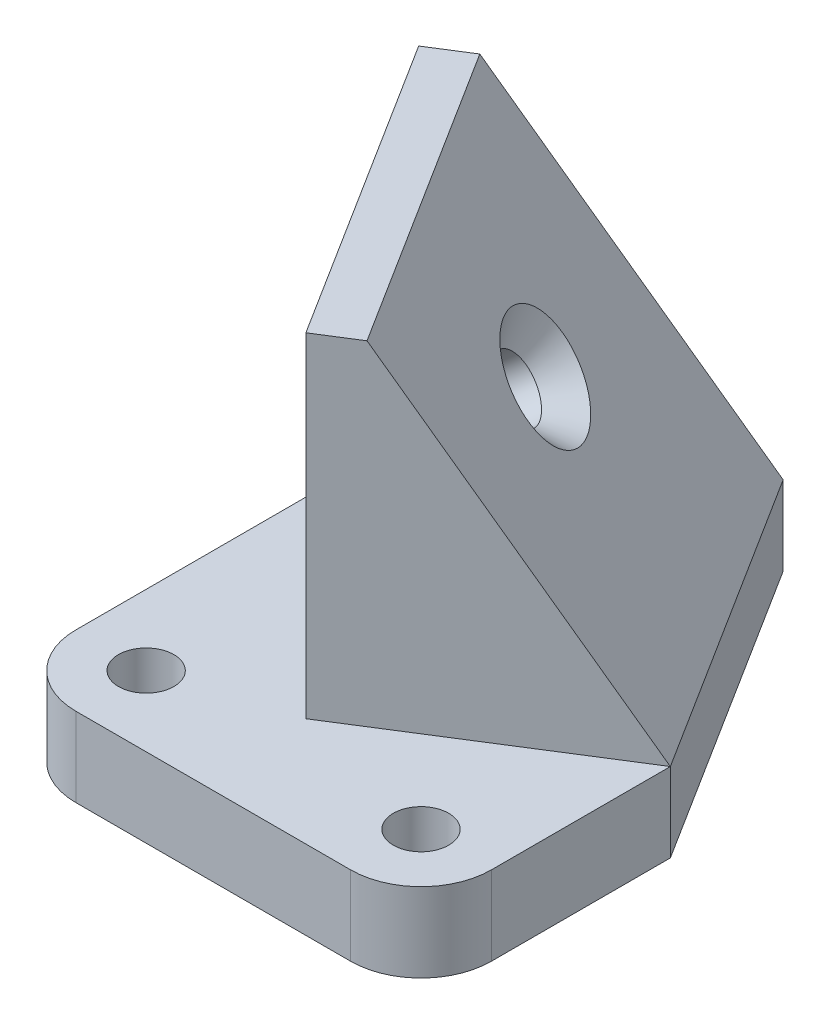
ISO-10303-21;
HEADER;
FILE_DESCRIPTION(('STEP AP214'),'2;1');
FILE_NAME('part.step','',(''),(''),'','','');
FILE_SCHEMA(('AUTOMOTIVE_DESIGN { 1 0 10303 214 1 1 1 1 }'));
ENDSEC;
DATA;
#1=APPLICATION_CONTEXT('core data for automotive mechanical design processes');
#2=APPLICATION_PROTOCOL_DEFINITION('international standard','automotive_design',2000,#1);
#3=PRODUCT_CONTEXT('',#1,'mechanical');
#4=PRODUCT('Part','Part','',(#3));
#5=PRODUCT_RELATED_PRODUCT_CATEGORY('part','',(#4));
#6=PRODUCT_DEFINITION_FORMATION('','',#4);
#7=PRODUCT_DEFINITION_CONTEXT('part definition',#1,'design');
#8=PRODUCT_DEFINITION('design','',#6,#7);
#9=PRODUCT_DEFINITION_SHAPE('','',#8);
#10=(LENGTH_UNIT() NAMED_UNIT(*) SI_UNIT(.MILLI.,.METRE.));
#11=(NAMED_UNIT(*) PLANE_ANGLE_UNIT() SI_UNIT($,.RADIAN.));
#12=(NAMED_UNIT(*) SI_UNIT($,.STERADIAN.) SOLID_ANGLE_UNIT());
#13=UNCERTAINTY_MEASURE_WITH_UNIT(LENGTH_MEASURE(1.E-05),#10,'distance_accuracy_value','');
#14=(GEOMETRIC_REPRESENTATION_CONTEXT(3) GLOBAL_UNCERTAINTY_ASSIGNED_CONTEXT((#13)) GLOBAL_UNIT_ASSIGNED_CONTEXT((#10,
#11,#12)) REPRESENTATION_CONTEXT('',''));
#15=CARTESIAN_POINT('',(0.,0.,0.));
#16=DIRECTION('',(0.,0.,1.));
#17=DIRECTION('',(1.,0.,0.));
#18=AXIS2_PLACEMENT_3D('',#15,#16,#17);
#19=CARTESIAN_POINT('',(0.,14.2875,-45.));
#20=DIRECTION('',(-0.846153846153846,0.,0.532938710021193));
#21=DIRECTION('',(0.532938710021193,0.,0.846153846153846));
#22=AXIS2_PLACEMENT_3D('',#19,#20,#21);
#23=PLANE('',#22);
#24=DIRECTION('',(-0.532938710021193,0.,-0.846153846153846));
#25=VECTOR('',#24,1.);
#26=CARTESIAN_POINT('',(0.,14.2875,-45.));
#27=LINE('',#26,#25);
#28=CARTESIAN_POINT('',(0.,14.2875,-45.));
#29=VERTEX_POINT('',#28);
#30=CARTESIAN_POINT('',(-34.6410161513775,14.2875,-100.));
#31=VERTEX_POINT('',#30);
#32=EDGE_CURVE('E285',#29,#31,#27,.T.);
#33=ORIENTED_EDGE('',*,*,#32,.F.);
#34=DIRECTION('',(0.,-1.,0.));
#35=VECTOR('',#34,1.);
#36=CARTESIAN_POINT('',(0.,14.2875,-45.));
#37=LINE('',#36,#35);
#38=CARTESIAN_POINT('',(0.,0.,-45.));
#39=VERTEX_POINT('',#38);
#40=EDGE_CURVE('E137',#29,#39,#37,.T.);
#41=ORIENTED_EDGE('',*,*,#40,.T.);
#42=DIRECTION('',(-0.532938710021193,0.,-0.846153846153846));
#43=VECTOR('',#42,1.);
#44=CARTESIAN_POINT('',(0.,0.,-45.));
#45=LINE('',#44,#43);
#46=CARTESIAN_POINT('',(-34.6410161513775,0.,-100.));
#47=VERTEX_POINT('',#46);
#48=EDGE_CURVE('E231',#39,#47,#45,.T.);
#49=ORIENTED_EDGE('',*,*,#48,.T.);
#50=DIRECTION('',(0.,-1.,0.));
#51=VECTOR('',#50,1.);
#52=CARTESIAN_POINT('',(-34.6410161513775,14.2875,-100.));
#53=LINE('',#52,#51);
#54=EDGE_CURVE('E140',#31,#47,#53,.T.);
#55=ORIENTED_EDGE('',*,*,#54,.F.);
#56=EDGE_LOOP('',(#33,#41,#49,#55));
#57=FACE_BOUND('',#56,.T.);
#58=ADVANCED_FACE('F34',(#57),#23,.F.);
#59=CARTESIAN_POINT('',(-34.6410161513775,14.2875,-100.));
#60=DIRECTION('',(0.532938710021193,0.,0.846153846153846));
#61=DIRECTION('',(0.846153846153846,0.,-0.532938710021193));
#62=AXIS2_PLACEMENT_3D('',#59,#60,#61);
#63=PLANE('',#62);
#64=DIRECTION('',(-0.46513764580854,0.835356795183334,0.292960740019407));
#65=VECTOR('',#64,1.);
#66=CARTESIAN_POINT('',(-34.6410161513776,14.2875,-100.));
#67=LINE('',#66,#65);
#68=CARTESIAN_POINT('',(-68.2307692307692,74.6125,-78.8439422010183));
#69=VERTEX_POINT('',#68);
#70=EDGE_CURVE('E288',#31,#69,#67,.T.);
#71=ORIENTED_EDGE('',*,*,#70,.F.);
#72=ORIENTED_EDGE('',*,*,#54,.T.);
#73=DIRECTION('',(-0.846153846153846,0.,0.532938710021193));
#74=VECTOR('',#73,1.);
#75=CARTESIAN_POINT('',(-34.6410161513775,0.,-100.));
#76=LINE('',#75,#74);
#77=CARTESIAN_POINT('',(-75.,0.,-74.5804325208488));
#78=VERTEX_POINT('',#77);
#79=EDGE_CURVE('E236',#47,#78,#76,.T.);
#80=ORIENTED_EDGE('',*,*,#79,.T.);
#81=DIRECTION('',(0.,-1.,0.));
#82=VECTOR('',#81,1.);
#83=CARTESIAN_POINT('',(-75.,14.2875,-74.5804325208488));
#84=LINE('',#83,#82);
#85=CARTESIAN_POINT('',(-75.,14.2875,-74.5804325208488));
#86=VERTEX_POINT('',#85);
#87=EDGE_CURVE('E148',#86,#78,#84,.T.);
#88=ORIENTED_EDGE('',*,*,#87,.F.);
#89=DIRECTION('',(0.,-1.,0.));
#90=VECTOR('',#89,1.);
#91=CARTESIAN_POINT('',(-75.,74.6125,-74.5804325208488));
#92=LINE('',#91,#90);
#93=CARTESIAN_POINT('',(-75.,74.6125,-74.5804325208488));
#94=VERTEX_POINT('',#93);
#95=EDGE_CURVE('E249',#94,#86,#92,.T.);
#96=ORIENTED_EDGE('',*,*,#95,.F.);
#97=DIRECTION('',(-0.846153846153846,0.,0.532938710021193));
#98=VECTOR('',#97,1.);
#99=CARTESIAN_POINT('',(-34.6410161513775,74.6125,-100.));
#100=LINE('',#99,#98);
#101=EDGE_CURVE('E299',#69,#94,#100,.T.);
#102=ORIENTED_EDGE('',*,*,#101,.F.);
#103=EDGE_LOOP('',(#71,#72,#80,#88,#96,#102));
#104=FACE_BOUND('',#103,.T.);
#105=ADVANCED_FACE('F181',(#104),#63,.F.);
#106=CARTESIAN_POINT('',(0.,74.6125,-45.));
#107=DIRECTION('',(0.532938710021193,0.,0.846153846153846));
#108=DIRECTION('',(0.846153846153846,0.,-0.532938710021193));
#109=AXIS2_PLACEMENT_3D('',#106,#107,#108);
#110=PLANE('',#109);
#111=DIRECTION('',(-0.846153846153846,0.,0.532938710021193));
#112=VECTOR('',#111,1.);
#113=CARTESIAN_POINT('',(0.,14.2875,-45.));
#114=LINE('',#113,#112);
#115=CARTESIAN_POINT('',(-40.3589838486224,14.2875,-19.5804325208488));
#116=VERTEX_POINT('',#115);
#117=EDGE_CURVE('E292',#29,#116,#114,.T.);
#118=ORIENTED_EDGE('',*,*,#117,.F.);
#119=DIRECTION('',(0.46513764580854,-0.835356795183334,-0.292960740019406));
#120=VECTOR('',#119,1.);
#121=CARTESIAN_POINT('',(-33.5897530793917,74.6125,-23.8439422010184));
#122=LINE('',#121,#120);
#123=CARTESIAN_POINT('',(-33.5897530793917,74.6125,-23.8439422010184));
#124=VERTEX_POINT('',#123);
#125=EDGE_CURVE('E282',#124,#29,#122,.T.);
#126=ORIENTED_EDGE('',*,*,#125,.F.);
#127=DIRECTION('',(-0.846153846153846,0.,0.532938710021193));
#128=VECTOR('',#127,1.);
#129=CARTESIAN_POINT('',(0.,74.6125,-45.));
#130=LINE('',#129,#128);
#131=CARTESIAN_POINT('',(-40.3589838486224,74.6125,-19.5804325208488));
#132=VERTEX_POINT('',#131);
#133=EDGE_CURVE('E293',#124,#132,#130,.T.);
#134=ORIENTED_EDGE('',*,*,#133,.T.);
#135=DIRECTION('',(0.,-1.,0.));
#136=VECTOR('',#135,1.);
#137=CARTESIAN_POINT('',(-40.3589838486224,74.6125,-19.5804325208488));
#138=LINE('',#137,#136);
#139=EDGE_CURVE('E301',#132,#116,#138,.T.);
#140=ORIENTED_EDGE('',*,*,#139,.T.);
#141=EDGE_LOOP('',(#118,#126,#134,#140));
#142=FACE_BOUND('',#141,.T.);
#143=ADVANCED_FACE('F172',(#142),#110,.T.);
#144=CARTESIAN_POINT('',(0.,74.6125,-45.));
#145=DIRECTION('',(0.,-1.,0.));
#146=DIRECTION('',(0.,0.,-1.));
#147=AXIS2_PLACEMENT_3D('',#144,#145,#146);
#148=PLANE('',#147);
#149=DIRECTION('',(-0.532938710021193,0.,-0.846153846153846));
#150=VECTOR('',#149,1.);
#151=CARTESIAN_POINT('',(-33.5897530793917,74.6125,-23.8439422010184));
#152=LINE('',#151,#150);
#153=EDGE_CURVE('E281',#124,#69,#152,.T.);
#154=ORIENTED_EDGE('',*,*,#153,.T.);
#155=ORIENTED_EDGE('',*,*,#101,.T.);
#156=DIRECTION('',(0.532938710021193,0.,0.846153846153846));
#157=VECTOR('',#156,1.);
#158=CARTESIAN_POINT('',(-75.,74.6125,-74.5804325208488));
#159=LINE('',#158,#157);
#160=EDGE_CURVE('E295',#94,#132,#159,.T.);
#161=ORIENTED_EDGE('',*,*,#160,.T.);
#162=ORIENTED_EDGE('',*,*,#133,.F.);
#163=EDGE_LOOP('',(#154,#155,#161,#162));
#164=FACE_BOUND('',#163,.T.);
#165=ADVANCED_FACE('F169',(#164),#148,.F.);
#166=CARTESIAN_POINT('',(0.,14.2875,0.));
#167=DIRECTION('',(0.,0.,1.));
#168=DIRECTION('',(1.,0.,0.));
#169=AXIS2_PLACEMENT_3D('',#166,#167,#168);
#170=PLANE('',#169);
#171=DIRECTION('',(-1.,0.,0.));
#172=VECTOR('',#171,1.);
#173=CARTESIAN_POINT('',(0.,0.,0.));
#174=LINE('',#173,#172);
#175=CARTESIAN_POINT('',(-12.7,0.,0.));
#176=VERTEX_POINT('',#175);
#177=CARTESIAN_POINT('',(-62.3,0.,0.));
#178=VERTEX_POINT('',#177);
#179=EDGE_CURVE('E246',#176,#178,#174,.T.);
#180=ORIENTED_EDGE('',*,*,#179,.F.);
#181=DIRECTION('',(0.,-1.,0.));
#182=VECTOR('',#181,1.);
#183=CARTESIAN_POINT('',(-12.7,14.2875,0.));
#184=LINE('',#183,#182);
#185=CARTESIAN_POINT('',(-12.7,14.2875,0.));
#186=VERTEX_POINT('',#185);
#187=EDGE_CURVE('E207',#176,#186,#184,.F.);
#188=ORIENTED_EDGE('',*,*,#187,.T.);
#189=DIRECTION('',(-1.,0.,0.));
#190=VECTOR('',#189,1.);
#191=CARTESIAN_POINT('',(0.,14.2875,0.));
#192=LINE('',#191,#190);
#193=CARTESIAN_POINT('',(-62.3,14.2875,0.));
#194=VERTEX_POINT('',#193);
#195=EDGE_CURVE('E232',#186,#194,#192,.T.);
#196=ORIENTED_EDGE('',*,*,#195,.T.);
#197=DIRECTION('',(0.,-1.,0.));
#198=VECTOR('',#197,1.);
#199=CARTESIAN_POINT('',(-62.3,14.2875,0.));
#200=LINE('',#199,#198);
#201=EDGE_CURVE('E213',#194,#178,#200,.T.);
#202=ORIENTED_EDGE('',*,*,#201,.T.);
#203=EDGE_LOOP('',(#180,#188,#196,#202));
#204=FACE_BOUND('',#203,.T.);
#205=ADVANCED_FACE('F171',(#204),#170,.T.);
#206=CARTESIAN_POINT('',(0.,14.2875,0.));
#207=DIRECTION('',(-1.,0.,0.));
#208=DIRECTION('',(0.,0.,1.));
#209=AXIS2_PLACEMENT_3D('',#206,#207,#208);
#210=PLANE('',#209);
#211=DIRECTION('',(0.,0.,-1.));
#212=VECTOR('',#211,1.);
#213=CARTESIAN_POINT('',(0.,14.2875,0.));
#214=LINE('',#213,#212);
#215=CARTESIAN_POINT('',(0.,14.2875,-12.7));
#216=VERTEX_POINT('',#215);
#217=EDGE_CURVE('E223',#216,#29,#214,.T.);
#218=ORIENTED_EDGE('',*,*,#217,.F.);
#219=DIRECTION('',(0.,-1.,0.));
#220=VECTOR('',#219,1.);
#221=CARTESIAN_POINT('',(0.,0.,-12.7));
#222=LINE('',#221,#220);
#223=CARTESIAN_POINT('',(0.,0.,-12.7));
#224=VERTEX_POINT('',#223);
#225=EDGE_CURVE('E133',#216,#224,#222,.T.);
#226=ORIENTED_EDGE('',*,*,#225,.T.);
#227=DIRECTION('',(0.,0.,-1.));
#228=VECTOR('',#227,1.);
#229=CARTESIAN_POINT('',(0.,0.,0.));
#230=LINE('',#229,#228);
#231=EDGE_CURVE('E222',#224,#39,#230,.T.);
#232=ORIENTED_EDGE('',*,*,#231,.T.);
#233=ORIENTED_EDGE('',*,*,#40,.F.);
#234=EDGE_LOOP('',(#218,#226,#232,#233));
#235=FACE_BOUND('',#234,.T.);
#236=ADVANCED_FACE('F178',(#235),#210,.F.);
#237=CARTESIAN_POINT('',(-75.,14.2875,0.));
#238=DIRECTION('',(-1.,0.,0.));
#239=DIRECTION('',(0.,0.,1.));
#240=AXIS2_PLACEMENT_3D('',#237,#238,#239);
#241=PLANE('',#240);
#242=DIRECTION('',(0.,0.,-1.));
#243=VECTOR('',#242,1.);
#244=CARTESIAN_POINT('',(-75.,0.,0.));
#245=LINE('',#244,#243);
#246=CARTESIAN_POINT('',(-75.,0.,-12.7));
#247=VERTEX_POINT('',#246);
#248=EDGE_CURVE('E248',#247,#78,#245,.T.);
#249=ORIENTED_EDGE('',*,*,#248,.F.);
#250=DIRECTION('',(0.,-1.,0.));
#251=VECTOR('',#250,1.);
#252=CARTESIAN_POINT('',(-75.,14.2875,-12.7));
#253=LINE('',#252,#251);
#254=CARTESIAN_POINT('',(-75.,14.2875,-12.7));
#255=VERTEX_POINT('',#254);
#256=EDGE_CURVE('E11',#247,#255,#253,.F.);
#257=ORIENTED_EDGE('',*,*,#256,.T.);
#258=DIRECTION('',(0.,0.,-1.));
#259=VECTOR('',#258,1.);
#260=CARTESIAN_POINT('',(-75.,14.2875,0.));
#261=LINE('',#260,#259);
#262=EDGE_CURVE('E234',#255,#86,#261,.T.);
#263=ORIENTED_EDGE('',*,*,#262,.T.);
#264=ORIENTED_EDGE('',*,*,#87,.T.);
#265=EDGE_LOOP('',(#249,#257,#263,#264));
#266=FACE_BOUND('',#265,.T.);
#267=ADVANCED_FACE('F195',(#266),#241,.T.);
#268=CARTESIAN_POINT('',(0.,14.2875,0.));
#269=DIRECTION('',(0.,-1.,0.));
#270=DIRECTION('',(0.,0.,-1.));
#271=AXIS2_PLACEMENT_3D('',#268,#269,#270);
#272=PLANE('',#271);
#273=CARTESIAN_POINT('',(-12.7,14.2875,-12.7));
#274=DIRECTION('',(0.,1.,0.));
#275=DIRECTION('',(0.,0.,1.));
#276=AXIS2_PLACEMENT_3D('',#273,#274,#275);
#277=CIRCLE('',#276,4.99999999999999);
#278=CARTESIAN_POINT('',(-12.7,14.2875,-7.70000000000001));
#279=VERTEX_POINT('',#278);
#280=EDGE_CURVE('E263',#279,#279,#277,.T.);
#281=ORIENTED_EDGE('',*,*,#280,.F.);
#282=EDGE_LOOP('',(#281));
#283=FACE_BOUND('',#282,.T.);
#284=CARTESIAN_POINT('',(-62.3,14.2875,-12.7));
#285=DIRECTION('',(0.,1.,0.));
#286=DIRECTION('',(0.,0.,1.));
#287=AXIS2_PLACEMENT_3D('',#284,#285,#286);
#288=CIRCLE('',#287,4.99999999999999);
#289=CARTESIAN_POINT('',(-62.3,14.2875,-7.7));
#290=VERTEX_POINT('',#289);
#291=EDGE_CURVE('E266',#290,#290,#288,.T.);
#292=ORIENTED_EDGE('',*,*,#291,.F.);
#293=EDGE_LOOP('',(#292));
#294=FACE_BOUND('',#293,.T.);
#295=ORIENTED_EDGE('',*,*,#195,.F.);
#296=CARTESIAN_POINT('',(-12.7,14.2875,-12.7));
#297=DIRECTION('',(0.,-1.,0.));
#298=DIRECTION('',(0.,0.,-1.));
#299=AXIS2_PLACEMENT_3D('',#296,#297,#298);
#300=CIRCLE('',#299,12.7);
#301=EDGE_CURVE('E42',#186,#216,#300,.F.);
#302=ORIENTED_EDGE('',*,*,#301,.T.);
#303=ORIENTED_EDGE('',*,*,#217,.T.);
#304=ORIENTED_EDGE('',*,*,#117,.T.);
#305=DIRECTION('',(0.532938710021193,0.,0.846153846153846));
#306=VECTOR('',#305,1.);
#307=CARTESIAN_POINT('',(-75.,14.2875,-74.5804325208488));
#308=LINE('',#307,#306);
#309=EDGE_CURVE('E296',#86,#116,#308,.T.);
#310=ORIENTED_EDGE('',*,*,#309,.F.);
#311=ORIENTED_EDGE('',*,*,#262,.F.);
#312=CARTESIAN_POINT('',(-62.3,14.2875,-12.7));
#313=DIRECTION('',(0.,-1.,0.));
#314=DIRECTION('',(0.,0.,-1.));
#315=AXIS2_PLACEMENT_3D('',#312,#313,#314);
#316=CIRCLE('',#315,12.7);
#317=EDGE_CURVE('E54',#255,#194,#316,.F.);
#318=ORIENTED_EDGE('',*,*,#317,.T.);
#319=EDGE_LOOP('',(#295,#302,#303,#304,#310,#311,#318));
#320=FACE_BOUND('',#319,.T.);
#321=ADVANCED_FACE('F197',(#283,#294,#320),#272,.F.);
#322=CARTESIAN_POINT('',(0.,0.,0.));
#323=DIRECTION('',(0.,-1.,0.));
#324=DIRECTION('',(0.,0.,-1.));
#325=AXIS2_PLACEMENT_3D('',#322,#323,#324);
#326=PLANE('',#325);
#327=CARTESIAN_POINT('',(-12.7,0.,-12.7));
#328=DIRECTION('',(0.,1.,0.));
#329=DIRECTION('',(0.,0.,1.));
#330=AXIS2_PLACEMENT_3D('',#327,#328,#329);
#331=CIRCLE('',#330,5.);
#332=CARTESIAN_POINT('',(-12.7,0.,-7.7));
#333=VERTEX_POINT('',#332);
#334=EDGE_CURVE('E268',#333,#333,#331,.T.);
#335=ORIENTED_EDGE('',*,*,#334,.T.);
#336=EDGE_LOOP('',(#335));
#337=FACE_BOUND('',#336,.T.);
#338=CARTESIAN_POINT('',(-62.3,0.,-12.7));
#339=DIRECTION('',(0.,1.,0.));
#340=DIRECTION('',(0.,0.,1.));
#341=AXIS2_PLACEMENT_3D('',#338,#339,#340);
#342=CIRCLE('',#341,5.);
#343=CARTESIAN_POINT('',(-62.3,0.,-7.69999999999999));
#344=VERTEX_POINT('',#343);
#345=EDGE_CURVE('E129',#344,#344,#342,.T.);
#346=ORIENTED_EDGE('',*,*,#345,.T.);
#347=EDGE_LOOP('',(#346));
#348=FACE_BOUND('',#347,.T.);
#349=ORIENTED_EDGE('',*,*,#231,.F.);
#350=CARTESIAN_POINT('',(-12.7,0.,-12.7));
#351=DIRECTION('',(0.,-1.,0.));
#352=DIRECTION('',(0.,0.,-1.));
#353=AXIS2_PLACEMENT_3D('',#350,#351,#352);
#354=CIRCLE('',#353,12.7);
#355=EDGE_CURVE('E216',#224,#176,#354,.T.);
#356=ORIENTED_EDGE('',*,*,#355,.T.);
#357=ORIENTED_EDGE('',*,*,#179,.T.);
#358=CARTESIAN_POINT('',(-62.3,0.,-12.7));
#359=DIRECTION('',(0.,-1.,0.));
#360=DIRECTION('',(0.,0.,-1.));
#361=AXIS2_PLACEMENT_3D('',#358,#359,#360);
#362=CIRCLE('',#361,12.7);
#363=EDGE_CURVE('E218',#178,#247,#362,.T.);
#364=ORIENTED_EDGE('',*,*,#363,.T.);
#365=ORIENTED_EDGE('',*,*,#248,.T.);
#366=ORIENTED_EDGE('',*,*,#79,.F.);
#367=ORIENTED_EDGE('',*,*,#48,.F.);
#368=EDGE_LOOP('',(#349,#356,#357,#364,#365,#366,#367));
#369=FACE_BOUND('',#368,.T.);
#370=ADVANCED_FACE('F226',(#337,#348,#369),#326,.T.);
#371=CARTESIAN_POINT('',(-75.,74.6125,-74.5804325208488));
#372=DIRECTION('',(0.846153846153846,0.,-0.532938710021193));
#373=DIRECTION('',(-0.532938710021193,0.,-0.846153846153846));
#374=AXIS2_PLACEMENT_3D('',#371,#372,#373);
#375=PLANE('',#374);
#376=CARTESIAN_POINT('',(-56.739118873641,40.5834786505,-45.5873897775052));
#377=CARTESIAN_POINT('',(-56.7606127053058,40.5376919836302,-45.6215158186236));
#378=CARTESIAN_POINT('',(-56.7832772235353,40.4923245532922,-45.657500574301));
#379=CARTESIAN_POINT('',(-56.8327758211862,40.4073182839117,-45.7360901531662));
#380=CARTESIAN_POINT('',(-56.8597228229884,40.367917921317,-45.7788742647131));
#381=CARTESIAN_POINT('',(-56.901423662135,40.322170259539,-45.8450832391566));
#382=CARTESIAN_POINT('',(-56.9142389524111,40.3098705507797,-45.8654302452058));
#383=CARTESIAN_POINT('',(-56.9406235510374,40.2889971227572,-45.9073214217841));
#384=CARTESIAN_POINT('',(-56.9541872251968,40.280398964607,-45.9288566468338));
#385=CARTESIAN_POINT('',(-56.9821274127641,40.267702159173,-45.97321765257));
#386=CARTESIAN_POINT('',(-56.9965126998301,40.2636687660473,-45.9960573633098));
#387=CARTESIAN_POINT('',(-57.0254372479741,40.260983149533,-46.041981251367));
#388=CARTESIAN_POINT('',(-57.0399765521421,40.2623324739865,-46.0650654970988));
#389=CARTESIAN_POINT('',(-57.0668925534376,40.2696956343001,-46.1078003887309));
#390=CARTESIAN_POINT('',(-57.0793174935956,40.2751232472855,-46.1275276307292));
#391=CARTESIAN_POINT('',(-57.1036035357752,40.2893347451022,-46.1660869014515));
#392=CARTESIAN_POINT('',(-57.1154642297083,40.298121018788,-46.1849182822479));
#393=CARTESIAN_POINT('',(-57.1469502243546,40.3257198338553,-46.234909012831));
#394=CARTESIAN_POINT('',(-57.16591128159,40.3471658637214,-46.2650137344532));
#395=CARTESIAN_POINT('',(-57.2020266380508,40.3949911329184,-46.3223545640831));
#396=CARTESIAN_POINT('',(-57.2191703640831,40.4213970016584,-46.3495738848922));
#397=CARTESIAN_POINT('',(-57.2479208765867,40.4703833694988,-46.3952214542588));
#398=CARTESIAN_POINT('',(-57.2598525368794,40.4923077432917,-46.4141655092838));
#399=CARTESIAN_POINT('',(-57.2828646415769,40.5371836309234,-46.4507021325986));
#400=CARTESIAN_POINT('',(-57.293953511446,40.5601198562692,-46.4683080781094));
#401=CARTESIAN_POINT('',(-57.3047628057336,40.5834786505034,-46.4854701377679));
#402=B_SPLINE_CURVE_WITH_KNOTS('',3,(#376,#377,#378,#379,#380,#381,#382,#383,#384,#385,#386,
#387,#388,#389,#390,#391,#392,#393,#394,#395,#396,#397,#398,#399,#400,#401),.UNSPECIFIED.,.F.,
.F.,(4,2,2,2,2,2,2,2,2,2,2,2,4),(0.,0.184942568464036,0.375988831169186,0.456775486705743,
0.537020261594434,0.61839820797139,0.699799556895229,0.771317723807631,0.842886853099791,
0.966790042397251,1.09137853769209,1.18532929332533,1.2781644125189),.UNSPECIFIED.);
#403=CARTESIAN_POINT('',(-56.7485935148361,40.5632569129637,-45.6024327907777));
#404=VERTEX_POINT('',#403);
#405=CARTESIAN_POINT('',(-57.2952881645358,40.5632569129639,-46.4704271244913));
#406=VERTEX_POINT('',#405);
#407=EDGE_CURVE('E125',#404,#406,#402,.T.);
#408=ORIENTED_EDGE('',*,*,#407,.T.);
#409=CARTESIAN_POINT('',(-57.0219408396865,34.0079357085876,-46.0364299576353));
#410=DIRECTION('',(0.846153846153846,0.,-0.532938710021193));
#411=DIRECTION('',(0.,1.,0.));
#412=AXIS2_PLACEMENT_3D('',#409,#410,#411);
#413=ELLIPSE('',#412,6.58401300104696,5.49999999999999);
#414=EDGE_CURVE('E131',#406,#404,#413,.T.);
#415=ORIENTED_EDGE('',*,*,#414,.T.);
#416=EDGE_LOOP('',(#408,#415));
#417=FACE_BOUND('',#416,.T.);
#418=ORIENTED_EDGE('',*,*,#309,.T.);
#419=ORIENTED_EDGE('',*,*,#139,.F.);
#420=ORIENTED_EDGE('',*,*,#160,.F.);
#421=ORIENTED_EDGE('',*,*,#95,.T.);
#422=EDGE_LOOP('',(#418,#419,#420,#421));
#423=FACE_BOUND('',#422,.T.);
#424=ADVANCED_FACE('F135',(#417,#423),#375,.F.);
#425=CARTESIAN_POINT('',(-33.5897530793917,74.6125,-23.8439422010184));
#426=DIRECTION('',(0.706840365155129,0.549708126864638,-0.445193972832444));
#427=DIRECTION('',(-0.613901227225881,0.789382849579694,0.));
#428=AXIS2_PLACEMENT_3D('',#425,#426,#427);
#429=PLANE('',#428);
#430=CARTESIAN_POINT('',(-36.5210868794799,49.951402699352,-58.9486192876817));
#431=DIRECTION('',(0.706840365155129,0.549708126864638,-0.445193972832444));
#432=DIRECTION('',(-0.613901227225881,0.789382849579694,0.));
#433=AXIS2_PLACEMENT_3D('',#430,#431,#432);
#434=CIRCLE('',#433,10.);
#435=CARTESIAN_POINT('',(-42.6600991517387,57.845231195149,-58.9486192876817));
#436=VERTEX_POINT('',#435);
#437=EDGE_CURVE('E278',#436,#436,#434,.T.);
#438=ORIENTED_EDGE('',*,*,#437,.F.);
#439=EDGE_LOOP('',(#438));
#440=FACE_BOUND('',#439,.T.);
#441=ORIENTED_EDGE('',*,*,#32,.T.);
#442=ORIENTED_EDGE('',*,*,#70,.T.);
#443=ORIENTED_EDGE('',*,*,#153,.F.);
#444=ORIENTED_EDGE('',*,*,#125,.T.);
#445=EDGE_LOOP('',(#441,#442,#443,#444));
#446=FACE_BOUND('',#445,.T.);
#447=ADVANCED_FACE('F161',(#440,#446),#429,.T.);
#448=CARTESIAN_POINT('',(-36.5210868794799,49.951402699352,-58.9486192876817));
#449=DIRECTION('',(0.706840365155129,0.549708126864638,-0.445193972832444));
#450=DIRECTION('',(-0.613901227225881,0.789382849579694,0.));
#451=AXIS2_PLACEMENT_3D('',#448,#449,#450);
#452=CYLINDRICAL_SURFACE('',#451,5.49999999999999);
#453=CARTESIAN_POINT('',(-39.701868522678,47.4777161284612,-56.9452464099357));
#454=DIRECTION('',(0.706840365155129,0.549708126864638,-0.445193972832444));
#455=DIRECTION('',(-0.613901227225881,0.789382849579694,0.));
#456=AXIS2_PLACEMENT_3D('',#453,#454,#455);
#457=CIRCLE('',#456,5.5);
#458=CARTESIAN_POINT('',(-43.0783252724204,51.8193218011495,-56.9452464099357));
#459=VERTEX_POINT('',#458);
#460=EDGE_CURVE('E128',#459,#459,#457,.T.);
#461=ORIENTED_EDGE('',*,*,#460,.T.);
#462=EDGE_LOOP('',(#461));
#463=FACE_BOUND('',#462,.T.);
#464=CARTESIAN_POINT('',(-54.4748321544202,35.9888162769902,-47.6406923777376));
#465=DIRECTION('',(0.706840365155129,0.549708126864638,-0.445193972832444));
#466=DIRECTION('',(-0.613901227225881,0.789382849579694,0.));
#467=AXIS2_PLACEMENT_3D('',#464,#465,#466);
#468=CIRCLE('',#467,5.5);
#469=EDGE_CURVE('E122',#404,#406,#468,.T.);
#470=ORIENTED_EDGE('',*,*,#469,.F.);
#471=ORIENTED_EDGE('',*,*,#414,.F.);
#472=EDGE_LOOP('',(#470,#471));
#473=FACE_BOUND('',#472,.T.);
#474=ADVANCED_FACE('F119',(#463,#473),#452,.F.);
#475=CARTESIAN_POINT('',(-54.4748321544202,35.9888162769902,-47.6406923777376));
#476=DIRECTION('',(0.706840365155129,0.549708126864638,-0.445193972832444));
#477=DIRECTION('',(-0.613901227225881,0.789382849579694,0.));
#478=AXIS2_PLACEMENT_3D('',#475,#476,#477);
#479=CONICAL_SURFACE('',#478,5.49999999999999,1.02974425867665);
#480=CARTESIAN_POINT('',(-56.8107511209045,34.1721774673322,-46.1694449841687));
#481=VERTEX_POINT('',#480);
#482=VERTEX_LOOP('',#481);
#483=FACE_BOUND('',#482,.T.);
#484=ORIENTED_EDGE('',*,*,#469,.T.);
#485=ORIENTED_EDGE('',*,*,#407,.F.);
#486=EDGE_LOOP('',(#484,#485));
#487=FACE_BOUND('',#486,.T.);
#488=ADVANCED_FACE('F115',(#483,#487),#479,.F.);
#489=CARTESIAN_POINT('',(-36.5210868794799,49.951402699352,-58.9486192876817));
#490=DIRECTION('',(0.706840365155129,0.549708126864638,-0.445193972832444));
#491=DIRECTION('',(-0.613901227225881,0.789382849579694,0.));
#492=AXIS2_PLACEMENT_3D('',#489,#490,#491);
#493=CONICAL_SURFACE('',#492,10.,0.785398163397449);
#494=ORIENTED_EDGE('',*,*,#460,.F.);
#495=EDGE_LOOP('',(#494));
#496=FACE_BOUND('',#495,.T.);
#497=ORIENTED_EDGE('',*,*,#437,.T.);
#498=EDGE_LOOP('',(#497));
#499=FACE_BOUND('',#498,.T.);
#500=ADVANCED_FACE('F118',(#496,#499),#493,.F.);
#501=CARTESIAN_POINT('',(-12.7,14.2875,-12.7));
#502=DIRECTION('',(0.,1.,0.));
#503=DIRECTION('',(0.,0.,1.));
#504=AXIS2_PLACEMENT_3D('',#501,#502,#503);
#505=CYLINDRICAL_SURFACE('',#504,12.7);
#506=ORIENTED_EDGE('',*,*,#301,.F.);
#507=ORIENTED_EDGE('',*,*,#187,.F.);
#508=ORIENTED_EDGE('',*,*,#355,.F.);
#509=ORIENTED_EDGE('',*,*,#225,.F.);
#510=EDGE_LOOP('',(#506,#507,#508,#509));
#511=FACE_BOUND('',#510,.T.);
#512=ADVANCED_FACE('F165',(#511),#505,.T.);
#513=CARTESIAN_POINT('',(-62.3,14.2875,-12.7));
#514=DIRECTION('',(0.,-1.,0.));
#515=DIRECTION('',(0.,0.,-1.));
#516=AXIS2_PLACEMENT_3D('',#513,#514,#515);
#517=CYLINDRICAL_SURFACE('',#516,12.7);
#518=ORIENTED_EDGE('',*,*,#317,.F.);
#519=ORIENTED_EDGE('',*,*,#256,.F.);
#520=ORIENTED_EDGE('',*,*,#363,.F.);
#521=ORIENTED_EDGE('',*,*,#201,.F.);
#522=EDGE_LOOP('',(#518,#519,#520,#521));
#523=FACE_BOUND('',#522,.T.);
#524=ADVANCED_FACE('F36',(#523),#517,.T.);
#525=CARTESIAN_POINT('',(-62.3,14.2875,-12.7));
#526=DIRECTION('',(0.,1.,0.));
#527=DIRECTION('',(0.,0.,1.));
#528=AXIS2_PLACEMENT_3D('',#525,#526,#527);
#529=CYLINDRICAL_SURFACE('',#528,4.99999999999999);
#530=ORIENTED_EDGE('',*,*,#345,.F.);
#531=EDGE_LOOP('',(#530));
#532=FACE_BOUND('',#531,.T.);
#533=ORIENTED_EDGE('',*,*,#291,.T.);
#534=EDGE_LOOP('',(#533));
#535=FACE_BOUND('',#534,.T.);
#536=ADVANCED_FACE('F157',(#532,#535),#529,.F.);
#537=CARTESIAN_POINT('',(-12.7,14.2875,-12.7));
#538=DIRECTION('',(0.,1.,0.));
#539=DIRECTION('',(0.,0.,1.));
#540=AXIS2_PLACEMENT_3D('',#537,#538,#539);
#541=CYLINDRICAL_SURFACE('',#540,4.99999999999999);
#542=ORIENTED_EDGE('',*,*,#334,.F.);
#543=EDGE_LOOP('',(#542));
#544=FACE_BOUND('',#543,.T.);
#545=ORIENTED_EDGE('',*,*,#280,.T.);
#546=EDGE_LOOP('',(#545));
#547=FACE_BOUND('',#546,.T.);
#548=ADVANCED_FACE('F382',(#544,#547),#541,.F.);
#549=CLOSED_SHELL('',(#58,#105,#143,#165,#205,#236,#267,#321,#370,#424,#447,#474,#488,#500,#512,
#524,#536,#548));
#550=MANIFOLD_SOLID_BREP('B2',#549);
#551=ADVANCED_BREP_SHAPE_REPRESENTATION('',(#18,#550),#14);
#552=SHAPE_DEFINITION_REPRESENTATION(#9,#551);
ENDSEC;
END-ISO-10303-21;
